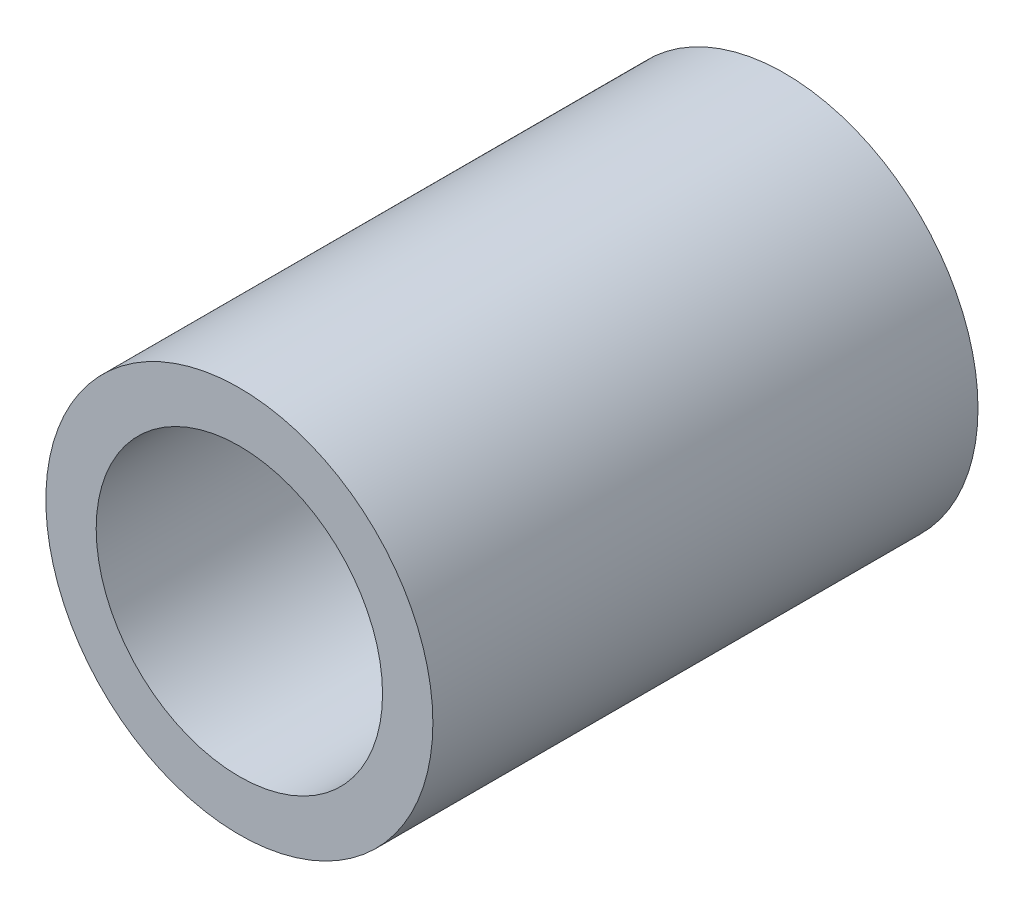
ISO-10303-21;
HEADER;
FILE_DESCRIPTION(('STEP AP214'),'2;1');
FILE_NAME('part.step','',(''),(''),'','','');
FILE_SCHEMA(('AUTOMOTIVE_DESIGN { 1 0 10303 214 1 1 1 1 }'));
ENDSEC;
DATA;
#1=APPLICATION_CONTEXT('core data for automotive mechanical design processes');
#2=APPLICATION_PROTOCOL_DEFINITION('international standard','automotive_design',2000,#1);
#3=PRODUCT_CONTEXT('',#1,'mechanical');
#4=PRODUCT('Part','Part','',(#3));
#5=PRODUCT_RELATED_PRODUCT_CATEGORY('part','',(#4));
#6=PRODUCT_DEFINITION_FORMATION('','',#4);
#7=PRODUCT_DEFINITION_CONTEXT('part definition',#1,'design');
#8=PRODUCT_DEFINITION('design','',#6,#7);
#9=PRODUCT_DEFINITION_SHAPE('','',#8);
#10=(LENGTH_UNIT() NAMED_UNIT(*) SI_UNIT(.MILLI.,.METRE.));
#11=(NAMED_UNIT(*) PLANE_ANGLE_UNIT() SI_UNIT($,.RADIAN.));
#12=(NAMED_UNIT(*) SI_UNIT($,.STERADIAN.) SOLID_ANGLE_UNIT());
#13=UNCERTAINTY_MEASURE_WITH_UNIT(LENGTH_MEASURE(1.E-05),#10,'distance_accuracy_value','');
#14=(GEOMETRIC_REPRESENTATION_CONTEXT(3) GLOBAL_UNCERTAINTY_ASSIGNED_CONTEXT((#13)) GLOBAL_UNIT_ASSIGNED_CONTEXT((#10,
#11,#12)) REPRESENTATION_CONTEXT('',''));
#15=CARTESIAN_POINT('',(0.,0.,0.));
#16=DIRECTION('',(0.,0.,1.));
#17=DIRECTION('',(1.,0.,0.));
#18=AXIS2_PLACEMENT_3D('',#15,#16,#17);
#19=CARTESIAN_POINT('',(0.,0.,30.));
#20=DIRECTION('',(0.,0.,1.));
#21=DIRECTION('',(1.,0.,0.));
#22=AXIS2_PLACEMENT_3D('',#19,#20,#21);
#23=PLANE('',#22);
#24=CARTESIAN_POINT('',(0.,0.,30.));
#25=DIRECTION('',(0.,0.,1.));
#26=DIRECTION('',(1.,0.,0.));
#27=AXIS2_PLACEMENT_3D('',#24,#25,#26);
#28=CIRCLE('',#27,10.65);
#29=CARTESIAN_POINT('',(10.65,0.,30.));
#30=VERTEX_POINT('',#29);
#31=EDGE_CURVE('E11',#30,#30,#28,.T.);
#32=ORIENTED_EDGE('',*,*,#31,.T.);
#33=EDGE_LOOP('',(#32));
#34=FACE_BOUND('',#33,.T.);
#35=CARTESIAN_POINT('',(0.,0.,30.));
#36=DIRECTION('',(0.,0.,1.));
#37=DIRECTION('',(1.,0.,0.));
#38=AXIS2_PLACEMENT_3D('',#35,#36,#37);
#39=CIRCLE('',#38,7.88);
#40=CARTESIAN_POINT('',(7.88,0.,30.));
#41=VERTEX_POINT('',#40);
#42=EDGE_CURVE('E51',#41,#41,#39,.T.);
#43=ORIENTED_EDGE('',*,*,#42,.F.);
#44=EDGE_LOOP('',(#43));
#45=FACE_BOUND('',#44,.T.);
#46=ADVANCED_FACE('F40',(#34,#45),#23,.T.);
#47=CARTESIAN_POINT('',(0.,0.,0.));
#48=DIRECTION('',(0.,0.,1.));
#49=DIRECTION('',(1.,0.,0.));
#50=AXIS2_PLACEMENT_3D('',#47,#48,#49);
#51=PLANE('',#50);
#52=CARTESIAN_POINT('',(0.,0.,0.));
#53=DIRECTION('',(0.,0.,1.));
#54=DIRECTION('',(1.,0.,0.));
#55=AXIS2_PLACEMENT_3D('',#52,#53,#54);
#56=CIRCLE('',#55,10.65);
#57=CARTESIAN_POINT('',(10.65,0.,0.));
#58=VERTEX_POINT('',#57);
#59=EDGE_CURVE('E44',#58,#58,#56,.T.);
#60=ORIENTED_EDGE('',*,*,#59,.F.);
#61=EDGE_LOOP('',(#60));
#62=FACE_BOUND('',#61,.T.);
#63=CARTESIAN_POINT('',(0.,0.,0.));
#64=DIRECTION('',(0.,0.,1.));
#65=DIRECTION('',(1.,0.,0.));
#66=AXIS2_PLACEMENT_3D('',#63,#64,#65);
#67=CIRCLE('',#66,7.88);
#68=CARTESIAN_POINT('',(7.88,0.,0.));
#69=VERTEX_POINT('',#68);
#70=EDGE_CURVE('E53',#69,#69,#67,.T.);
#71=ORIENTED_EDGE('',*,*,#70,.T.);
#72=EDGE_LOOP('',(#71));
#73=FACE_BOUND('',#72,.T.);
#74=ADVANCED_FACE('F63',(#62,#73),#51,.F.);
#75=CARTESIAN_POINT('',(0.,0.,30.));
#76=DIRECTION('',(0.,0.,-1.));
#77=DIRECTION('',(-1.,0.,0.));
#78=AXIS2_PLACEMENT_3D('',#75,#76,#77);
#79=CYLINDRICAL_SURFACE('',#78,10.65);
#80=ORIENTED_EDGE('',*,*,#31,.F.);
#81=EDGE_LOOP('',(#80));
#82=FACE_BOUND('',#81,.T.);
#83=ORIENTED_EDGE('',*,*,#59,.T.);
#84=EDGE_LOOP('',(#83));
#85=FACE_BOUND('',#84,.T.);
#86=ADVANCED_FACE('F42',(#82,#85),#79,.T.);
#87=CARTESIAN_POINT('',(0.,0.,30.));
#88=DIRECTION('',(0.,0.,-1.));
#89=DIRECTION('',(-1.,0.,0.));
#90=AXIS2_PLACEMENT_3D('',#87,#88,#89);
#91=CYLINDRICAL_SURFACE('',#90,7.88);
#92=ORIENTED_EDGE('',*,*,#42,.T.);
#93=EDGE_LOOP('',(#92));
#94=FACE_BOUND('',#93,.T.);
#95=ORIENTED_EDGE('',*,*,#70,.F.);
#96=EDGE_LOOP('',(#95));
#97=FACE_BOUND('',#96,.T.);
#98=ADVANCED_FACE('F59',(#94,#97),#91,.F.);
#99=CLOSED_SHELL('',(#46,#74,#86,#98));
#100=MANIFOLD_SOLID_BREP('B2',#99);
#101=ADVANCED_BREP_SHAPE_REPRESENTATION('',(#18,#100),#14);
#102=SHAPE_DEFINITION_REPRESENTATION(#9,#101);
ENDSEC;
END-ISO-10303-21;
